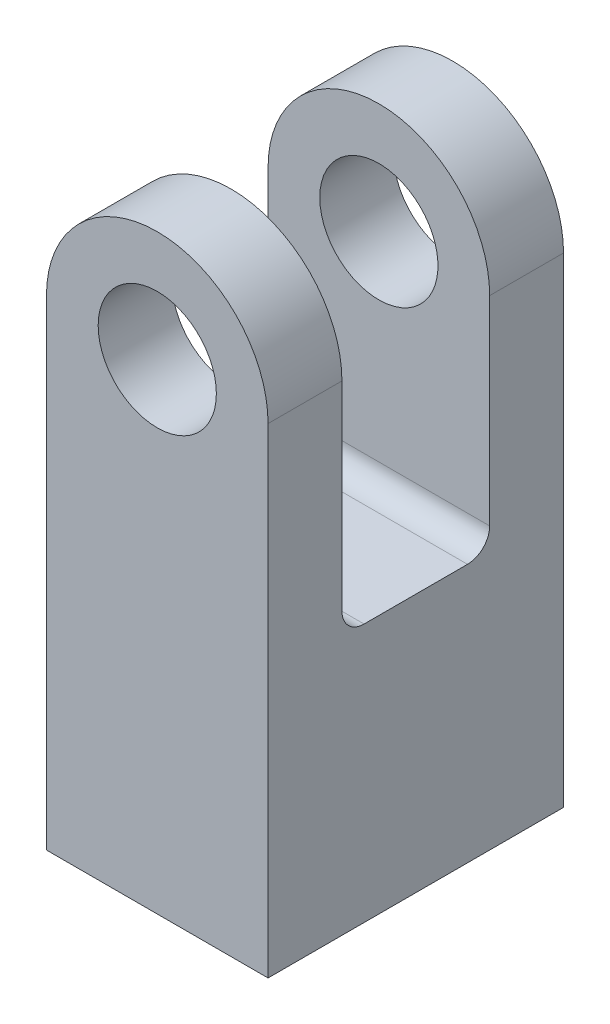
ISO-10303-21;
HEADER;
FILE_DESCRIPTION(('STEP AP214'),'2;1');
FILE_NAME('part.step','',(''),(''),'','','');
FILE_SCHEMA(('AUTOMOTIVE_DESIGN { 1 0 10303 214 1 1 1 1 }'));
ENDSEC;
DATA;
#1=APPLICATION_CONTEXT('core data for automotive mechanical design processes');
#2=APPLICATION_PROTOCOL_DEFINITION('international standard','automotive_design',2000,#1);
#3=PRODUCT_CONTEXT('',#1,'mechanical');
#4=PRODUCT('Part','Part','',(#3));
#5=PRODUCT_RELATED_PRODUCT_CATEGORY('part','',(#4));
#6=PRODUCT_DEFINITION_FORMATION('','',#4);
#7=PRODUCT_DEFINITION_CONTEXT('part definition',#1,'design');
#8=PRODUCT_DEFINITION('design','',#6,#7);
#9=PRODUCT_DEFINITION_SHAPE('','',#8);
#10=(LENGTH_UNIT() NAMED_UNIT(*) SI_UNIT(.MILLI.,.METRE.));
#11=(NAMED_UNIT(*) PLANE_ANGLE_UNIT() SI_UNIT($,.RADIAN.));
#12=(NAMED_UNIT(*) SI_UNIT($,.STERADIAN.) SOLID_ANGLE_UNIT());
#13=UNCERTAINTY_MEASURE_WITH_UNIT(LENGTH_MEASURE(1.E-05),#10,'distance_accuracy_value','');
#14=(GEOMETRIC_REPRESENTATION_CONTEXT(3) GLOBAL_UNCERTAINTY_ASSIGNED_CONTEXT((#13)) GLOBAL_UNIT_ASSIGNED_CONTEXT((#10,
#11,#12)) REPRESENTATION_CONTEXT('',''));
#15=CARTESIAN_POINT('',(0.,0.,0.));
#16=DIRECTION('',(0.,0.,1.));
#17=DIRECTION('',(1.,0.,0.));
#18=AXIS2_PLACEMENT_3D('',#15,#16,#17);
#19=CARTESIAN_POINT('',(15.,65.,40.));
#20=DIRECTION('',(0.,0.,-1.));
#21=DIRECTION('',(-1.,0.,0.));
#22=AXIS2_PLACEMENT_3D('',#19,#20,#21);
#23=CYLINDRICAL_SURFACE('',#22,15.);
#24=CARTESIAN_POINT('',(15.,65.,30.));
#25=DIRECTION('',(0.,0.,-1.));
#26=DIRECTION('',(-1.,0.,0.));
#27=AXIS2_PLACEMENT_3D('',#24,#25,#26);
#28=CIRCLE('',#27,15.);
#29=CARTESIAN_POINT('',(0.,65.,30.));
#30=VERTEX_POINT('',#29);
#31=CARTESIAN_POINT('',(30.,65.,30.));
#32=VERTEX_POINT('',#31);
#33=EDGE_CURVE('E115',#30,#32,#28,.T.);
#34=ORIENTED_EDGE('',*,*,#33,.F.);
#35=DIRECTION('',(0.,0.,-1.));
#36=VECTOR('',#35,1.);
#37=CARTESIAN_POINT('',(0.,65.,40.));
#38=LINE('',#37,#36);
#39=CARTESIAN_POINT('',(0.,65.,40.));
#40=VERTEX_POINT('',#39);
#41=EDGE_CURVE('E126',#40,#30,#38,.T.);
#42=ORIENTED_EDGE('',*,*,#41,.F.);
#43=CARTESIAN_POINT('',(15.,65.,40.));
#44=DIRECTION('',(0.,0.,1.));
#45=DIRECTION('',(1.,0.,0.));
#46=AXIS2_PLACEMENT_3D('',#43,#44,#45);
#47=CIRCLE('',#46,15.);
#48=CARTESIAN_POINT('',(30.,65.,40.));
#49=VERTEX_POINT('',#48);
#50=EDGE_CURVE('E141',#49,#40,#47,.T.);
#51=ORIENTED_EDGE('',*,*,#50,.F.);
#52=DIRECTION('',(0.,0.,-1.));
#53=VECTOR('',#52,1.);
#54=CARTESIAN_POINT('',(30.,65.,40.));
#55=LINE('',#54,#53);
#56=EDGE_CURVE('E129',#49,#32,#55,.T.);
#57=ORIENTED_EDGE('',*,*,#56,.T.);
#58=EDGE_LOOP('',(#34,#42,#51,#57));
#59=FACE_BOUND('',#58,.T.);
#60=ADVANCED_FACE('F34',(#59),#23,.T.);
#61=CARTESIAN_POINT('',(15.,65.,40.));
#62=DIRECTION('',(0.,0.,-1.));
#63=DIRECTION('',(-1.,0.,0.));
#64=AXIS2_PLACEMENT_3D('',#61,#62,#63);
#65=CYLINDRICAL_SURFACE('',#64,8.00000000000001);
#66=CARTESIAN_POINT('',(15.,65.,40.));
#67=DIRECTION('',(0.,0.,1.));
#68=DIRECTION('',(1.,0.,0.));
#69=AXIS2_PLACEMENT_3D('',#66,#67,#68);
#70=CIRCLE('',#69,8.00000000000001);
#71=CARTESIAN_POINT('',(23.,65.,40.));
#72=VERTEX_POINT('',#71);
#73=EDGE_CURVE('E194',#72,#72,#70,.T.);
#74=ORIENTED_EDGE('',*,*,#73,.T.);
#75=EDGE_LOOP('',(#74));
#76=FACE_BOUND('',#75,.T.);
#77=CARTESIAN_POINT('',(15.,65.,30.));
#78=DIRECTION('',(0.,0.,-1.));
#79=DIRECTION('',(-1.,0.,0.));
#80=AXIS2_PLACEMENT_3D('',#77,#78,#79);
#81=CIRCLE('',#80,8.00000000000001);
#82=CARTESIAN_POINT('',(6.99999999999999,65.,30.));
#83=VERTEX_POINT('',#82);
#84=EDGE_CURVE('E131',#83,#83,#81,.T.);
#85=ORIENTED_EDGE('',*,*,#84,.T.);
#86=EDGE_LOOP('',(#85));
#87=FACE_BOUND('',#86,.T.);
#88=ADVANCED_FACE('F237',(#76,#87),#65,.F.);
#89=CARTESIAN_POINT('',(15.,65.,40.));
#90=DIRECTION('',(0.,0.,1.));
#91=DIRECTION('',(1.,0.,0.));
#92=AXIS2_PLACEMENT_3D('',#89,#90,#91);
#93=PLANE('',#92);
#94=DIRECTION('',(0.,-1.,0.));
#95=VECTOR('',#94,1.);
#96=CARTESIAN_POINT('',(0.,65.,40.));
#97=LINE('',#96,#95);
#98=CARTESIAN_POINT('',(0.,0.,40.));
#99=VERTEX_POINT('',#98);
#100=EDGE_CURVE('E136',#40,#99,#97,.T.);
#101=ORIENTED_EDGE('',*,*,#100,.T.);
#102=DIRECTION('',(1.,0.,0.));
#103=VECTOR('',#102,1.);
#104=CARTESIAN_POINT('',(0.,0.,40.));
#105=LINE('',#104,#103);
#106=CARTESIAN_POINT('',(30.,0.,40.));
#107=VERTEX_POINT('',#106);
#108=EDGE_CURVE('E201',#99,#107,#105,.T.);
#109=ORIENTED_EDGE('',*,*,#108,.T.);
#110=DIRECTION('',(0.,1.,0.));
#111=VECTOR('',#110,1.);
#112=CARTESIAN_POINT('',(30.,0.,40.));
#113=LINE('',#112,#111);
#114=EDGE_CURVE('E203',#107,#49,#113,.T.);
#115=ORIENTED_EDGE('',*,*,#114,.T.);
#116=ORIENTED_EDGE('',*,*,#50,.T.);
#117=EDGE_LOOP('',(#101,#109,#115,#116));
#118=FACE_BOUND('',#117,.T.);
#119=ORIENTED_EDGE('',*,*,#73,.F.);
#120=EDGE_LOOP('',(#119));
#121=FACE_BOUND('',#120,.T.);
#122=ADVANCED_FACE('F225',(#118,#121),#93,.T.);
#123=CARTESIAN_POINT('',(15.,65.,0.));
#124=DIRECTION('',(0.,0.,1.));
#125=DIRECTION('',(1.,0.,0.));
#126=AXIS2_PLACEMENT_3D('',#123,#124,#125);
#127=PLANE('',#126);
#128=DIRECTION('',(0.,-1.,0.));
#129=VECTOR('',#128,1.);
#130=CARTESIAN_POINT('',(0.,65.,0.));
#131=LINE('',#130,#129);
#132=CARTESIAN_POINT('',(0.,65.,0.));
#133=VERTEX_POINT('',#132);
#134=CARTESIAN_POINT('',(0.,0.,0.));
#135=VERTEX_POINT('',#134);
#136=EDGE_CURVE('E197',#133,#135,#131,.T.);
#137=ORIENTED_EDGE('',*,*,#136,.F.);
#138=CARTESIAN_POINT('',(15.,65.,0.));
#139=DIRECTION('',(0.,0.,1.));
#140=DIRECTION('',(1.,0.,0.));
#141=AXIS2_PLACEMENT_3D('',#138,#139,#140);
#142=CIRCLE('',#141,15.);
#143=CARTESIAN_POINT('',(30.,65.,0.));
#144=VERTEX_POINT('',#143);
#145=EDGE_CURVE('E143',#144,#133,#142,.T.);
#146=ORIENTED_EDGE('',*,*,#145,.F.);
#147=DIRECTION('',(0.,1.,0.));
#148=VECTOR('',#147,1.);
#149=CARTESIAN_POINT('',(30.,0.,0.));
#150=LINE('',#149,#148);
#151=CARTESIAN_POINT('',(30.,0.,0.));
#152=VERTEX_POINT('',#151);
#153=EDGE_CURVE('E209',#152,#144,#150,.T.);
#154=ORIENTED_EDGE('',*,*,#153,.F.);
#155=DIRECTION('',(1.,0.,0.));
#156=VECTOR('',#155,1.);
#157=CARTESIAN_POINT('',(0.,0.,0.));
#158=LINE('',#157,#156);
#159=EDGE_CURVE('E208',#135,#152,#158,.T.);
#160=ORIENTED_EDGE('',*,*,#159,.F.);
#161=EDGE_LOOP('',(#137,#146,#154,#160));
#162=FACE_BOUND('',#161,.T.);
#163=CARTESIAN_POINT('',(15.,65.,0.));
#164=DIRECTION('',(0.,0.,1.));
#165=DIRECTION('',(1.,0.,0.));
#166=AXIS2_PLACEMENT_3D('',#163,#164,#165);
#167=CIRCLE('',#166,8.00000000000001);
#168=CARTESIAN_POINT('',(23.,65.,0.));
#169=VERTEX_POINT('',#168);
#170=EDGE_CURVE('E193',#169,#169,#167,.T.);
#171=ORIENTED_EDGE('',*,*,#170,.T.);
#172=EDGE_LOOP('',(#171));
#173=FACE_BOUND('',#172,.T.);
#174=ADVANCED_FACE('F218',(#162,#173),#127,.F.);
#175=CARTESIAN_POINT('',(0.,65.,40.));
#176=DIRECTION('',(1.,0.,0.));
#177=DIRECTION('',(0.,1.,0.));
#178=AXIS2_PLACEMENT_3D('',#175,#176,#177);
#179=PLANE('',#178);
#180=DIRECTION('',(0.,0.,1.));
#181=VECTOR('',#180,1.);
#182=CARTESIAN_POINT('',(0.,35.,10.));
#183=LINE('',#182,#181);
#184=CARTESIAN_POINT('',(0.,35.,13.));
#185=VERTEX_POINT('',#184);
#186=CARTESIAN_POINT('',(0.,35.,27.));
#187=VERTEX_POINT('',#186);
#188=EDGE_CURVE('E180',#185,#187,#183,.T.);
#189=ORIENTED_EDGE('',*,*,#188,.F.);
#190=CARTESIAN_POINT('',(0.,38.,13.));
#191=DIRECTION('',(1.,0.,0.));
#192=DIRECTION('',(0.,1.,0.));
#193=AXIS2_PLACEMENT_3D('',#190,#191,#192);
#194=CIRCLE('',#193,3.);
#195=CARTESIAN_POINT('',(0.,38.,10.));
#196=VERTEX_POINT('',#195);
#197=EDGE_CURVE('E11',#185,#196,#194,.T.);
#198=ORIENTED_EDGE('',*,*,#197,.T.);
#199=DIRECTION('',(0.,-1.,0.));
#200=VECTOR('',#199,1.);
#201=CARTESIAN_POINT('',(0.,35.,10.));
#202=LINE('',#201,#200);
#203=CARTESIAN_POINT('',(0.,65.,10.));
#204=VERTEX_POINT('',#203);
#205=EDGE_CURVE('E185',#204,#196,#202,.T.);
#206=ORIENTED_EDGE('',*,*,#205,.F.);
#207=EDGE_CURVE('E138',#204,#133,#38,.T.);
#208=ORIENTED_EDGE('',*,*,#207,.T.);
#209=ORIENTED_EDGE('',*,*,#136,.T.);
#210=DIRECTION('',(0.,0.,-1.));
#211=VECTOR('',#210,1.);
#212=CARTESIAN_POINT('',(0.,0.,40.));
#213=LINE('',#212,#211);
#214=EDGE_CURVE('E149',#99,#135,#213,.T.);
#215=ORIENTED_EDGE('',*,*,#214,.F.);
#216=ORIENTED_EDGE('',*,*,#100,.F.);
#217=ORIENTED_EDGE('',*,*,#41,.T.);
#218=DIRECTION('',(0.,-1.,0.));
#219=VECTOR('',#218,1.);
#220=CARTESIAN_POINT('',(0.,35.,30.));
#221=LINE('',#220,#219);
#222=CARTESIAN_POINT('',(0.,38.,30.));
#223=VERTEX_POINT('',#222);
#224=EDGE_CURVE('E111',#30,#223,#221,.T.);
#225=ORIENTED_EDGE('',*,*,#224,.T.);
#226=CARTESIAN_POINT('',(0.,38.,27.));
#227=DIRECTION('',(1.,0.,0.));
#228=DIRECTION('',(0.,1.,0.));
#229=AXIS2_PLACEMENT_3D('',#226,#227,#228);
#230=CIRCLE('',#229,3.);
#231=EDGE_CURVE('E168',#223,#187,#230,.T.);
#232=ORIENTED_EDGE('',*,*,#231,.T.);
#233=EDGE_LOOP('',(#189,#198,#206,#208,#209,#215,#216,#217,#225,#232));
#234=FACE_BOUND('',#233,.T.);
#235=ADVANCED_FACE('F133',(#234),#179,.F.);
#236=CARTESIAN_POINT('',(0.,0.,40.));
#237=DIRECTION('',(0.,1.,0.));
#238=DIRECTION('',(0.,0.,1.));
#239=AXIS2_PLACEMENT_3D('',#236,#237,#238);
#240=PLANE('',#239);
#241=ORIENTED_EDGE('',*,*,#159,.T.);
#242=DIRECTION('',(0.,0.,-1.));
#243=VECTOR('',#242,1.);
#244=CARTESIAN_POINT('',(30.,0.,40.));
#245=LINE('',#244,#243);
#246=EDGE_CURVE('E146',#107,#152,#245,.T.);
#247=ORIENTED_EDGE('',*,*,#246,.F.);
#248=ORIENTED_EDGE('',*,*,#108,.F.);
#249=ORIENTED_EDGE('',*,*,#214,.T.);
#250=EDGE_LOOP('',(#241,#247,#248,#249));
#251=FACE_BOUND('',#250,.T.);
#252=ADVANCED_FACE('F221',(#251),#240,.F.);
#253=CARTESIAN_POINT('',(30.,0.,40.));
#254=DIRECTION('',(-1.,0.,0.));
#255=DIRECTION('',(0.,0.,1.));
#256=AXIS2_PLACEMENT_3D('',#253,#254,#255);
#257=PLANE('',#256);
#258=CARTESIAN_POINT('',(30.,65.,10.));
#259=VERTEX_POINT('',#258);
#260=EDGE_CURVE('E137',#259,#144,#55,.T.);
#261=ORIENTED_EDGE('',*,*,#260,.F.);
#262=DIRECTION('',(0.,1.,0.));
#263=VECTOR('',#262,1.);
#264=CARTESIAN_POINT('',(30.,35.,10.));
#265=LINE('',#264,#263);
#266=CARTESIAN_POINT('',(30.,38.,10.));
#267=VERTEX_POINT('',#266);
#268=EDGE_CURVE('E175',#267,#259,#265,.T.);
#269=ORIENTED_EDGE('',*,*,#268,.F.);
#270=CARTESIAN_POINT('',(30.,38.,13.));
#271=DIRECTION('',(-1.,0.,0.));
#272=DIRECTION('',(0.,0.,1.));
#273=AXIS2_PLACEMENT_3D('',#270,#271,#272);
#274=CIRCLE('',#273,3.);
#275=CARTESIAN_POINT('',(30.,35.,13.));
#276=VERTEX_POINT('',#275);
#277=EDGE_CURVE('E42',#267,#276,#274,.T.);
#278=ORIENTED_EDGE('',*,*,#277,.T.);
#279=DIRECTION('',(0.,0.,1.));
#280=VECTOR('',#279,1.);
#281=CARTESIAN_POINT('',(30.,35.,10.));
#282=LINE('',#281,#280);
#283=CARTESIAN_POINT('',(30.,35.,27.));
#284=VERTEX_POINT('',#283);
#285=EDGE_CURVE('E155',#276,#284,#282,.T.);
#286=ORIENTED_EDGE('',*,*,#285,.T.);
#287=CARTESIAN_POINT('',(30.,38.,27.));
#288=DIRECTION('',(-1.,0.,0.));
#289=DIRECTION('',(0.,0.,1.));
#290=AXIS2_PLACEMENT_3D('',#287,#288,#289);
#291=CIRCLE('',#290,3.);
#292=CARTESIAN_POINT('',(30.,38.,30.));
#293=VERTEX_POINT('',#292);
#294=EDGE_CURVE('E166',#284,#293,#291,.T.);
#295=ORIENTED_EDGE('',*,*,#294,.T.);
#296=DIRECTION('',(0.,1.,0.));
#297=VECTOR('',#296,1.);
#298=CARTESIAN_POINT('',(30.,35.,30.));
#299=LINE('',#298,#297);
#300=EDGE_CURVE('E121',#293,#32,#299,.T.);
#301=ORIENTED_EDGE('',*,*,#300,.T.);
#302=ORIENTED_EDGE('',*,*,#56,.F.);
#303=ORIENTED_EDGE('',*,*,#114,.F.);
#304=ORIENTED_EDGE('',*,*,#246,.T.);
#305=ORIENTED_EDGE('',*,*,#153,.T.);
#306=EDGE_LOOP('',(#261,#269,#278,#286,#295,#301,#302,#303,#304,#305));
#307=FACE_BOUND('',#306,.T.);
#308=ADVANCED_FACE('F174',(#307),#257,.F.);
#309=ORIENTED_EDGE('',*,*,#207,.F.);
#310=CARTESIAN_POINT('',(15.,65.,10.));
#311=DIRECTION('',(0.,0.,-1.));
#312=DIRECTION('',(-1.,0.,0.));
#313=AXIS2_PLACEMENT_3D('',#310,#311,#312);
#314=CIRCLE('',#313,15.);
#315=EDGE_CURVE('E158',#204,#259,#314,.T.);
#316=ORIENTED_EDGE('',*,*,#315,.T.);
#317=ORIENTED_EDGE('',*,*,#260,.T.);
#318=ORIENTED_EDGE('',*,*,#145,.T.);
#319=EDGE_LOOP('',(#309,#316,#317,#318));
#320=FACE_BOUND('',#319,.T.);
#321=ADVANCED_FACE('F216',(#320),#23,.T.);
#322=CARTESIAN_POINT('',(15.,65.,10.));
#323=DIRECTION('',(0.,0.,-1.));
#324=DIRECTION('',(-1.,0.,0.));
#325=AXIS2_PLACEMENT_3D('',#322,#323,#324);
#326=CIRCLE('',#325,8.00000000000001);
#327=CARTESIAN_POINT('',(6.99999999999999,65.,10.));
#328=VERTEX_POINT('',#327);
#329=EDGE_CURVE('E130',#328,#328,#326,.T.);
#330=ORIENTED_EDGE('',*,*,#329,.F.);
#331=EDGE_LOOP('',(#330));
#332=FACE_BOUND('',#331,.T.);
#333=ORIENTED_EDGE('',*,*,#170,.F.);
#334=EDGE_LOOP('',(#333));
#335=FACE_BOUND('',#334,.T.);
#336=ADVANCED_FACE('F244',(#332,#335),#65,.F.);
#337=CARTESIAN_POINT('',(0.,0.,10.));
#338=DIRECTION('',(0.,0.,-1.));
#339=DIRECTION('',(-1.,0.,0.));
#340=AXIS2_PLACEMENT_3D('',#337,#338,#339);
#341=PLANE('',#340);
#342=ORIENTED_EDGE('',*,*,#329,.T.);
#343=EDGE_LOOP('',(#342));
#344=FACE_BOUND('',#343,.T.);
#345=ORIENTED_EDGE('',*,*,#205,.T.);
#346=DIRECTION('',(1.,0.,0.));
#347=VECTOR('',#346,1.);
#348=CARTESIAN_POINT('',(30.,38.,10.));
#349=LINE('',#348,#347);
#350=EDGE_CURVE('E164',#196,#267,#349,.T.);
#351=ORIENTED_EDGE('',*,*,#350,.T.);
#352=ORIENTED_EDGE('',*,*,#268,.T.);
#353=ORIENTED_EDGE('',*,*,#315,.F.);
#354=EDGE_LOOP('',(#345,#351,#352,#353));
#355=FACE_BOUND('',#354,.T.);
#356=ADVANCED_FACE('F183',(#344,#355),#341,.F.);
#357=CARTESIAN_POINT('',(0.,0.,30.));
#358=DIRECTION('',(0.,0.,-1.));
#359=DIRECTION('',(-1.,0.,0.));
#360=AXIS2_PLACEMENT_3D('',#357,#358,#359);
#361=PLANE('',#360);
#362=ORIENTED_EDGE('',*,*,#84,.F.);
#363=EDGE_LOOP('',(#362));
#364=FACE_BOUND('',#363,.T.);
#365=ORIENTED_EDGE('',*,*,#300,.F.);
#366=DIRECTION('',(1.,0.,0.));
#367=VECTOR('',#366,1.);
#368=CARTESIAN_POINT('',(0.,38.,30.));
#369=LINE('',#368,#367);
#370=EDGE_CURVE('E118',#293,#223,#369,.F.);
#371=ORIENTED_EDGE('',*,*,#370,.T.);
#372=ORIENTED_EDGE('',*,*,#224,.F.);
#373=ORIENTED_EDGE('',*,*,#33,.T.);
#374=EDGE_LOOP('',(#365,#371,#372,#373));
#375=FACE_BOUND('',#374,.T.);
#376=ADVANCED_FACE('F114',(#364,#375),#361,.T.);
#377=CARTESIAN_POINT('',(0.,35.,10.));
#378=DIRECTION('',(0.,-1.,0.));
#379=DIRECTION('',(0.,0.,-1.));
#380=AXIS2_PLACEMENT_3D('',#377,#378,#379);
#381=PLANE('',#380);
#382=ORIENTED_EDGE('',*,*,#188,.T.);
#383=DIRECTION('',(1.,0.,0.));
#384=VECTOR('',#383,1.);
#385=CARTESIAN_POINT('',(0.,35.,27.));
#386=LINE('',#385,#384);
#387=EDGE_CURVE('E160',#187,#284,#386,.T.);
#388=ORIENTED_EDGE('',*,*,#387,.T.);
#389=ORIENTED_EDGE('',*,*,#285,.F.);
#390=DIRECTION('',(1.,0.,0.));
#391=VECTOR('',#390,1.);
#392=CARTESIAN_POINT('',(0.,35.,13.));
#393=LINE('',#392,#391);
#394=EDGE_CURVE('E152',#276,#185,#393,.F.);
#395=ORIENTED_EDGE('',*,*,#394,.T.);
#396=EDGE_LOOP('',(#382,#388,#389,#395));
#397=FACE_BOUND('',#396,.T.);
#398=ADVANCED_FACE('F178',(#397),#381,.F.);
#399=CARTESIAN_POINT('',(0.,38.,27.));
#400=DIRECTION('',(1.,0.,0.));
#401=DIRECTION('',(0.,0.,-1.));
#402=AXIS2_PLACEMENT_3D('',#399,#400,#401);
#403=CYLINDRICAL_SURFACE('',#402,3.);
#404=ORIENTED_EDGE('',*,*,#231,.F.);
#405=ORIENTED_EDGE('',*,*,#370,.F.);
#406=ORIENTED_EDGE('',*,*,#294,.F.);
#407=ORIENTED_EDGE('',*,*,#387,.F.);
#408=EDGE_LOOP('',(#404,#405,#406,#407));
#409=FACE_BOUND('',#408,.T.);
#410=ADVANCED_FACE('F228',(#409),#403,.F.);
#411=CARTESIAN_POINT('',(0.,38.,13.));
#412=DIRECTION('',(-1.,0.,0.));
#413=DIRECTION('',(0.,0.,1.));
#414=AXIS2_PLACEMENT_3D('',#411,#412,#413);
#415=CYLINDRICAL_SURFACE('',#414,3.);
#416=ORIENTED_EDGE('',*,*,#197,.F.);
#417=ORIENTED_EDGE('',*,*,#394,.F.);
#418=ORIENTED_EDGE('',*,*,#277,.F.);
#419=ORIENTED_EDGE('',*,*,#350,.F.);
#420=EDGE_LOOP('',(#416,#417,#418,#419));
#421=FACE_BOUND('',#420,.T.);
#422=ADVANCED_FACE('F36',(#421),#415,.F.);
#423=CLOSED_SHELL('',(#60,#88,#122,#174,#235,#252,#308,#321,#336,#356,#376,#398,#410,#422));
#424=MANIFOLD_SOLID_BREP('B2',#423);
#425=ADVANCED_BREP_SHAPE_REPRESENTATION('',(#18,#424),#14);
#426=SHAPE_DEFINITION_REPRESENTATION(#9,#425);
ENDSEC;
END-ISO-10303-21;
